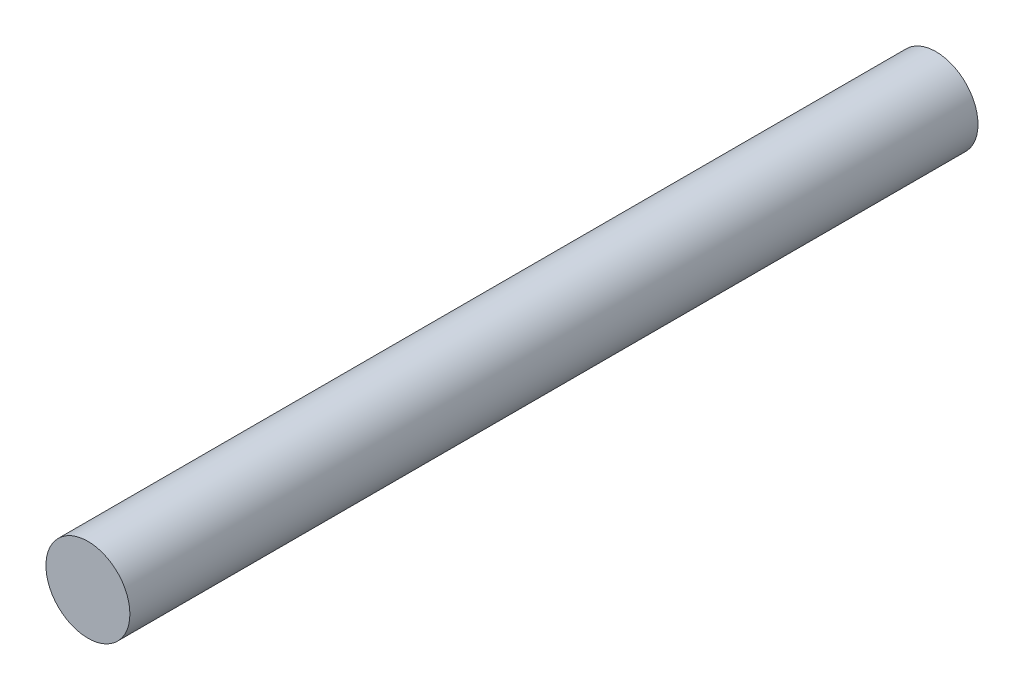
ISO-10303-21;
HEADER;
FILE_DESCRIPTION(('STEP AP214'),'2;1');
FILE_NAME('part.step','',(''),(''),'','','');
FILE_SCHEMA(('AUTOMOTIVE_DESIGN { 1 0 10303 214 1 1 1 1 }'));
ENDSEC;
DATA;
#1=APPLICATION_CONTEXT('core data for automotive mechanical design processes');
#2=APPLICATION_PROTOCOL_DEFINITION('international standard','automotive_design',2000,#1);
#3=PRODUCT_CONTEXT('',#1,'mechanical');
#4=PRODUCT('Part','Part','',(#3));
#5=PRODUCT_RELATED_PRODUCT_CATEGORY('part','',(#4));
#6=PRODUCT_DEFINITION_FORMATION('','',#4);
#7=PRODUCT_DEFINITION_CONTEXT('part definition',#1,'design');
#8=PRODUCT_DEFINITION('design','',#6,#7);
#9=PRODUCT_DEFINITION_SHAPE('','',#8);
#10=(LENGTH_UNIT() NAMED_UNIT(*) SI_UNIT(.MILLI.,.METRE.));
#11=(NAMED_UNIT(*) PLANE_ANGLE_UNIT() SI_UNIT($,.RADIAN.));
#12=(NAMED_UNIT(*) SI_UNIT($,.STERADIAN.) SOLID_ANGLE_UNIT());
#13=UNCERTAINTY_MEASURE_WITH_UNIT(LENGTH_MEASURE(1.E-05),#10,'distance_accuracy_value','');
#14=(GEOMETRIC_REPRESENTATION_CONTEXT(3) GLOBAL_UNCERTAINTY_ASSIGNED_CONTEXT((#13)) GLOBAL_UNIT_ASSIGNED_CONTEXT((#10,
#11,#12)) REPRESENTATION_CONTEXT('',''));
#15=CARTESIAN_POINT('',(0.,0.,0.));
#16=DIRECTION('',(0.,0.,1.));
#17=DIRECTION('',(1.,0.,0.));
#18=AXIS2_PLACEMENT_3D('',#15,#16,#17);
#19=CARTESIAN_POINT('',(0.,0.,101.));
#20=DIRECTION('',(0.,0.,-1.));
#21=DIRECTION('',(-1.,0.,0.));
#22=AXIS2_PLACEMENT_3D('',#19,#20,#21);
#23=CYLINDRICAL_SURFACE('',#22,5.);
#24=CARTESIAN_POINT('',(0.,0.,101.));
#25=DIRECTION('',(0.,0.,1.));
#26=DIRECTION('',(1.,0.,0.));
#27=AXIS2_PLACEMENT_3D('',#24,#25,#26);
#28=CIRCLE('',#27,5.);
#29=CARTESIAN_POINT('',(5.,0.,101.));
#30=VERTEX_POINT('',#29);
#31=EDGE_CURVE('E10',#30,#30,#28,.T.);
#32=ORIENTED_EDGE('',*,*,#31,.F.);
#33=EDGE_LOOP('',(#32));
#34=FACE_BOUND('',#33,.T.);
#35=CARTESIAN_POINT('',(0.,0.,0.));
#36=DIRECTION('',(0.,0.,1.));
#37=DIRECTION('',(1.,0.,0.));
#38=AXIS2_PLACEMENT_3D('',#35,#36,#37);
#39=CIRCLE('',#38,5.);
#40=CARTESIAN_POINT('',(5.,0.,0.));
#41=VERTEX_POINT('',#40);
#42=EDGE_CURVE('E44',#41,#41,#39,.T.);
#43=ORIENTED_EDGE('',*,*,#42,.T.);
#44=EDGE_LOOP('',(#43));
#45=FACE_BOUND('',#44,.T.);
#46=ADVANCED_FACE('F41',(#34,#45),#23,.T.);
#47=CARTESIAN_POINT('',(0.,0.,101.));
#48=DIRECTION('',(0.,0.,1.));
#49=DIRECTION('',(1.,0.,0.));
#50=AXIS2_PLACEMENT_3D('',#47,#48,#49);
#51=PLANE('',#50);
#52=ORIENTED_EDGE('',*,*,#31,.T.);
#53=EDGE_LOOP('',(#52));
#54=FACE_BOUND('',#53,.T.);
#55=ADVANCED_FACE('F56',(#54),#51,.T.);
#56=CARTESIAN_POINT('',(0.,0.,0.));
#57=DIRECTION('',(0.,0.,1.));
#58=DIRECTION('',(1.,0.,0.));
#59=AXIS2_PLACEMENT_3D('',#56,#57,#58);
#60=PLANE('',#59);
#61=ORIENTED_EDGE('',*,*,#42,.F.);
#62=EDGE_LOOP('',(#61));
#63=FACE_BOUND('',#62,.T.);
#64=ADVANCED_FACE('F54',(#63),#60,.F.);
#65=CLOSED_SHELL('',(#46,#55,#64));
#66=MANIFOLD_SOLID_BREP('B2',#65);
#67=ADVANCED_BREP_SHAPE_REPRESENTATION('',(#18,#66),#14);
#68=SHAPE_DEFINITION_REPRESENTATION(#9,#67);
ENDSEC;
END-ISO-10303-21;
